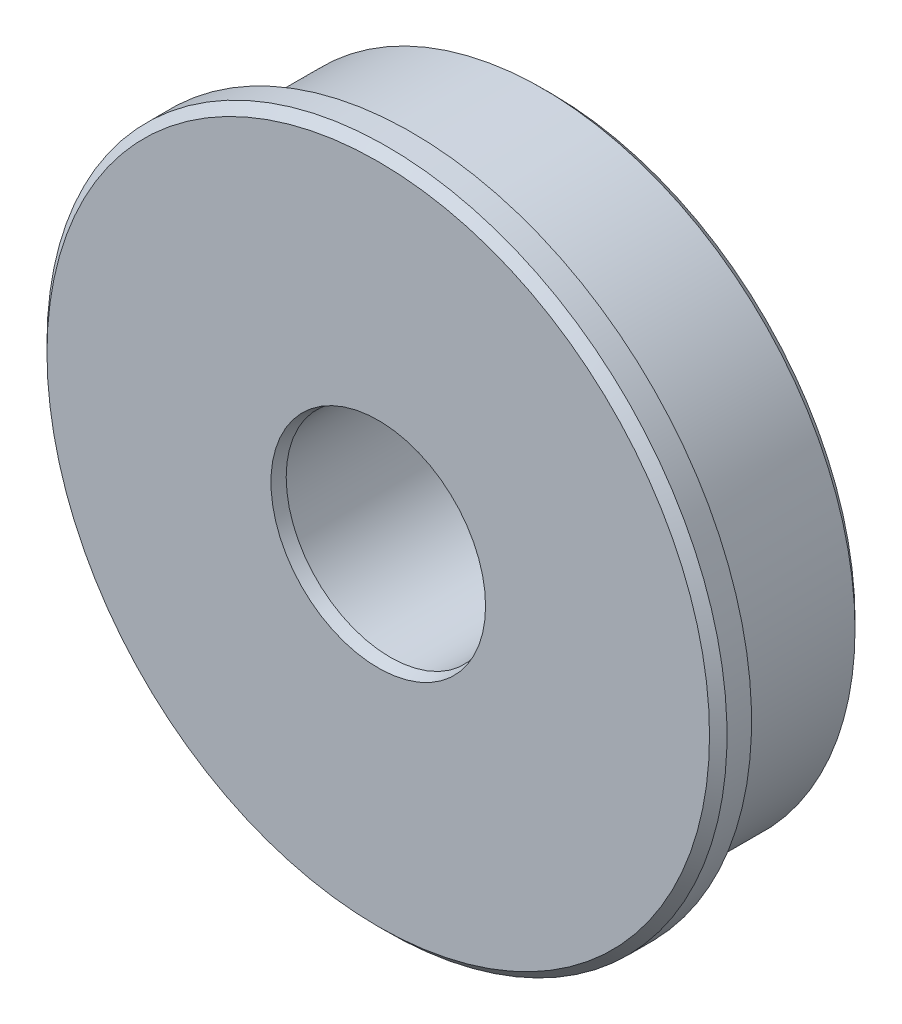
ISO-10303-21;
HEADER;
FILE_DESCRIPTION(('STEP AP214'),'2;1');
FILE_NAME('part.step','',(''),(''),'','','');
FILE_SCHEMA(('AUTOMOTIVE_DESIGN { 1 0 10303 214 1 1 1 1 }'));
ENDSEC;
DATA;
#1=APPLICATION_CONTEXT('core data for automotive mechanical design processes');
#2=APPLICATION_PROTOCOL_DEFINITION('international standard','automotive_design',2000,#1);
#3=PRODUCT_CONTEXT('',#1,'mechanical');
#4=PRODUCT('Part','Part','',(#3));
#5=PRODUCT_RELATED_PRODUCT_CATEGORY('part','',(#4));
#6=PRODUCT_DEFINITION_FORMATION('','',#4);
#7=PRODUCT_DEFINITION_CONTEXT('part definition',#1,'design');
#8=PRODUCT_DEFINITION('design','',#6,#7);
#9=PRODUCT_DEFINITION_SHAPE('','',#8);
#10=(LENGTH_UNIT() NAMED_UNIT(*) SI_UNIT(.MILLI.,.METRE.));
#11=(NAMED_UNIT(*) PLANE_ANGLE_UNIT() SI_UNIT($,.RADIAN.));
#12=(NAMED_UNIT(*) SI_UNIT($,.STERADIAN.) SOLID_ANGLE_UNIT());
#13=UNCERTAINTY_MEASURE_WITH_UNIT(LENGTH_MEASURE(1.E-05),#10,'distance_accuracy_value','');
#14=(GEOMETRIC_REPRESENTATION_CONTEXT(3) GLOBAL_UNCERTAINTY_ASSIGNED_CONTEXT((#13)) GLOBAL_UNIT_ASSIGNED_CONTEXT((#10,
#11,#12)) REPRESENTATION_CONTEXT('',''));
#15=CARTESIAN_POINT('',(0.,0.,0.));
#16=DIRECTION('',(0.,0.,1.));
#17=DIRECTION('',(1.,0.,0.));
#18=AXIS2_PLACEMENT_3D('',#15,#16,#17);
#19=CARTESIAN_POINT('',(0.,0.,7.92733999999998));
#20=DIRECTION('',(0.,0.,-1.));
#21=DIRECTION('',(-1.,0.,0.));
#22=AXIS2_PLACEMENT_3D('',#19,#20,#21);
#23=CYLINDRICAL_SURFACE('',#22,14.2875);
#24=CARTESIAN_POINT('',(0.,0.,5.89534));
#25=DIRECTION('',(0.,0.,-1.));
#26=DIRECTION('',(-1.,0.,0.));
#27=AXIS2_PLACEMENT_3D('',#24,#25,#26);
#28=CIRCLE('',#27,14.2875);
#29=CARTESIAN_POINT('',(-14.2875,0.,5.89534));
#30=VERTEX_POINT('',#29);
#31=EDGE_CURVE('E18',#30,#30,#28,.F.);
#32=ORIENTED_EDGE('',*,*,#31,.F.);
#33=EDGE_LOOP('',(#32));
#34=FACE_BOUND('',#33,.T.);
#35=CARTESIAN_POINT('',(0.,0.,0.399999999999989));
#36=DIRECTION('',(0.,0.,1.));
#37=DIRECTION('',(1.,0.,0.));
#38=AXIS2_PLACEMENT_3D('',#35,#36,#37);
#39=CIRCLE('',#38,14.2875);
#40=CARTESIAN_POINT('',(14.2875,0.,0.399999999999988));
#41=VERTEX_POINT('',#40);
#42=EDGE_CURVE('E30',#41,#41,#39,.F.);
#43=ORIENTED_EDGE('',*,*,#42,.F.);
#44=EDGE_LOOP('',(#43));
#45=FACE_BOUND('',#44,.T.);
#46=ADVANCED_FACE('F15',(#34,#45),#23,.T.);
#47=CARTESIAN_POINT('',(0.,0.,0.399999999999989));
#48=DIRECTION('',(0.,0.,1.));
#49=DIRECTION('',(0.,-1.,0.));
#50=AXIS2_PLACEMENT_3D('',#47,#48,#49);
#51=CONICAL_SURFACE('',#50,14.2875,0.785398163397453);
#52=ORIENTED_EDGE('',*,*,#42,.T.);
#53=EDGE_LOOP('',(#52));
#54=FACE_BOUND('',#53,.T.);
#55=CARTESIAN_POINT('',(0.,0.,0.));
#56=DIRECTION('',(0.,0.,1.));
#57=DIRECTION('',(0.,-1.,0.));
#58=AXIS2_PLACEMENT_3D('',#55,#56,#57);
#59=CIRCLE('',#58,13.8875);
#60=CARTESIAN_POINT('',(0.,-13.8875,0.));
#61=VERTEX_POINT('',#60);
#62=EDGE_CURVE('E46',#61,#61,#59,.F.);
#63=ORIENTED_EDGE('',*,*,#62,.F.);
#64=EDGE_LOOP('',(#63));
#65=FACE_BOUND('',#64,.T.);
#66=ADVANCED_FACE('F56',(#54,#65),#51,.T.);
#67=CARTESIAN_POINT('',(14.2875,0.,5.89534));
#68=DIRECTION('',(0.,0.,1.));
#69=DIRECTION('',(1.,0.,0.));
#70=AXIS2_PLACEMENT_3D('',#67,#68,#69);
#71=PLANE('',#70);
#72=ORIENTED_EDGE('',*,*,#31,.T.);
#73=EDGE_LOOP('',(#72));
#74=FACE_BOUND('',#73,.T.);
#75=CARTESIAN_POINT('',(0.,0.,5.89534));
#76=DIRECTION('',(0.,0.,-1.));
#77=DIRECTION('',(-1.,0.,0.));
#78=AXIS2_PLACEMENT_3D('',#75,#76,#77);
#79=CIRCLE('',#78,13.97);
#80=CARTESIAN_POINT('',(-13.97,0.,5.89534));
#81=VERTEX_POINT('',#80);
#82=EDGE_CURVE('E44',#81,#81,#79,.F.);
#83=ORIENTED_EDGE('',*,*,#82,.F.);
#84=EDGE_LOOP('',(#83));
#85=FACE_BOUND('',#84,.T.);
#86=ADVANCED_FACE('F65',(#74,#85),#71,.T.);
#87=CARTESIAN_POINT('',(0.,0.,0.));
#88=DIRECTION('',(0.,0.,-1.));
#89=DIRECTION('',(-1.,0.,0.));
#90=AXIS2_PLACEMENT_3D('',#87,#88,#89);
#91=PLANE('',#90);
#92=CARTESIAN_POINT('',(0.,0.,5.6843418860808E-11));
#93=DIRECTION('',(0.,0.,-1.));
#94=DIRECTION('',(-1.,0.,0.));
#95=AXIS2_PLACEMENT_3D('',#92,#93,#94);
#96=CIRCLE('',#95,4.91249999994738);
#97=CARTESIAN_POINT('',(-4.91249999994738,0.,5.6843418860808E-11));
#98=VERTEX_POINT('',#97);
#99=EDGE_CURVE('E41',#98,#98,#96,.F.);
#100=ORIENTED_EDGE('',*,*,#99,.T.);
#101=EDGE_LOOP('',(#100));
#102=FACE_BOUND('',#101,.T.);
#103=ORIENTED_EDGE('',*,*,#62,.T.);
#104=EDGE_LOOP('',(#103));
#105=FACE_BOUND('',#104,.T.);
#106=ADVANCED_FACE('F100',(#102,#105),#91,.T.);
#107=CARTESIAN_POINT('',(0.,0.,7.92733999999998));
#108=DIRECTION('',(0.,0.,-1.));
#109=DIRECTION('',(-1.,0.,0.));
#110=AXIS2_PLACEMENT_3D('',#107,#108,#109);
#111=CYLINDRICAL_SURFACE('',#110,13.97);
#112=CARTESIAN_POINT('',(0.,0.,6.40334000000001));
#113=DIRECTION('',(0.,0.,-1.));
#114=DIRECTION('',(-1.,0.,0.));
#115=AXIS2_PLACEMENT_3D('',#112,#113,#114);
#116=CIRCLE('',#115,13.97);
#117=CARTESIAN_POINT('',(-13.97,0.,6.40334000000001));
#118=VERTEX_POINT('',#117);
#119=EDGE_CURVE('E38',#118,#118,#116,.F.);
#120=ORIENTED_EDGE('',*,*,#119,.F.);
#121=EDGE_LOOP('',(#120));
#122=FACE_BOUND('',#121,.T.);
#123=ORIENTED_EDGE('',*,*,#82,.T.);
#124=EDGE_LOOP('',(#123));
#125=FACE_BOUND('',#124,.T.);
#126=ADVANCED_FACE('F96',(#122,#125),#111,.T.);
#127=CARTESIAN_POINT('',(0.,0.,1.13686837721616E-10));
#128=DIRECTION('',(0.,0.,-1.));
#129=DIRECTION('',(-1.,0.,0.));
#130=AXIS2_PLACEMENT_3D('',#127,#128,#129);
#131=CONICAL_SURFACE('',#130,4.91249999993215,0.261799387786168);
#132=CARTESIAN_POINT('',(0.,0.,0.559807621135305));
#133=DIRECTION('',(0.,0.,-1.));
#134=DIRECTION('',(-1.,0.,0.));
#135=AXIS2_PLACEMENT_3D('',#132,#133,#134);
#136=CIRCLE('',#135,4.76250000000001);
#137=CARTESIAN_POINT('',(-4.76250000000001,0.,0.559807621135305));
#138=VERTEX_POINT('',#137);
#139=EDGE_CURVE('E37',#138,#138,#136,.F.);
#140=ORIENTED_EDGE('',*,*,#139,.T.);
#141=EDGE_LOOP('',(#140));
#142=FACE_BOUND('',#141,.T.);
#143=ORIENTED_EDGE('',*,*,#99,.F.);
#144=EDGE_LOOP('',(#143));
#145=FACE_BOUND('',#144,.T.);
#146=ADVANCED_FACE('F92',(#142,#145),#131,.F.);
#147=CARTESIAN_POINT('',(13.9700000000001,0.,6.40333999999998));
#148=DIRECTION('',(0.,0.,-1.));
#149=DIRECTION('',(-1.,0.,0.));
#150=AXIS2_PLACEMENT_3D('',#147,#148,#149);
#151=PLANE('',#150);
#152=ORIENTED_EDGE('',*,*,#119,.T.);
#153=EDGE_LOOP('',(#152));
#154=FACE_BOUND('',#153,.T.);
#155=CARTESIAN_POINT('',(0.,0.,6.40334000000001));
#156=DIRECTION('',(0.,0.,-1.));
#157=DIRECTION('',(-1.,0.,0.));
#158=AXIS2_PLACEMENT_3D('',#155,#156,#157);
#159=CIRCLE('',#158,15.5575);
#160=CARTESIAN_POINT('',(-15.5575,0.,6.40334000000001));
#161=VERTEX_POINT('',#160);
#162=EDGE_CURVE('E33',#161,#161,#159,.F.);
#163=ORIENTED_EDGE('',*,*,#162,.F.);
#164=EDGE_LOOP('',(#163));
#165=FACE_BOUND('',#164,.T.);
#166=ADVANCED_FACE('F88',(#154,#165),#151,.T.);
#167=CARTESIAN_POINT('',(0.,0.,7.92733999999998));
#168=DIRECTION('',(0.,0.,-1.));
#169=DIRECTION('',(-1.,0.,0.));
#170=AXIS2_PLACEMENT_3D('',#167,#168,#169);
#171=CYLINDRICAL_SURFACE('',#170,4.76250000000001);
#172=CARTESIAN_POINT('',(0.,0.,7.37734000006185));
#173=DIRECTION('',(0.,0.,1.));
#174=DIRECTION('',(1.,0.,0.));
#175=AXIS2_PLACEMENT_3D('',#172,#173,#174);
#176=CIRCLE('',#175,4.76250000002665);
#177=CARTESIAN_POINT('',(4.76250000002665,0.,7.37734000006185));
#178=VERTEX_POINT('',#177);
#179=EDGE_CURVE('E36',#178,#178,#176,.T.);
#180=ORIENTED_EDGE('',*,*,#179,.T.);
#181=EDGE_LOOP('',(#180));
#182=FACE_BOUND('',#181,.T.);
#183=ORIENTED_EDGE('',*,*,#139,.F.);
#184=EDGE_LOOP('',(#183));
#185=FACE_BOUND('',#184,.T.);
#186=ADVANCED_FACE('F84',(#182,#185),#171,.F.);
#187=CARTESIAN_POINT('',(0.,0.,7.92733999999998));
#188=DIRECTION('',(0.,0.,-1.));
#189=DIRECTION('',(-1.,0.,0.));
#190=AXIS2_PLACEMENT_3D('',#187,#188,#189);
#191=CYLINDRICAL_SURFACE('',#190,15.5575);
#192=ORIENTED_EDGE('',*,*,#162,.T.);
#193=EDGE_LOOP('',(#192));
#194=FACE_BOUND('',#193,.T.);
#195=CARTESIAN_POINT('',(0.,0.,7.52734));
#196=DIRECTION('',(0.,0.,-1.));
#197=DIRECTION('',(-1.,0.,0.));
#198=AXIS2_PLACEMENT_3D('',#195,#196,#197);
#199=CIRCLE('',#198,15.5575);
#200=CARTESIAN_POINT('',(-15.5575,0.,7.52734));
#201=VERTEX_POINT('',#200);
#202=EDGE_CURVE('E27',#201,#201,#199,.F.);
#203=ORIENTED_EDGE('',*,*,#202,.F.);
#204=EDGE_LOOP('',(#203));
#205=FACE_BOUND('',#204,.T.);
#206=ADVANCED_FACE('F80',(#194,#205),#191,.T.);
#207=CARTESIAN_POINT('',(0.,0.,7.92733999975326));
#208=DIRECTION('',(0.,0.,1.));
#209=DIRECTION('',(1.,0.,0.));
#210=AXIS2_PLACEMENT_3D('',#207,#208,#209);
#211=CONICAL_SURFACE('',#210,4.90987205577653,0.261799387787974);
#212=ORIENTED_EDGE('',*,*,#179,.F.);
#213=EDGE_LOOP('',(#212));
#214=FACE_BOUND('',#213,.T.);
#215=CARTESIAN_POINT('',(0.,0.,7.92733999998063));
#216=DIRECTION('',(0.,0.,1.));
#217=DIRECTION('',(1.,0.,0.));
#218=AXIS2_PLACEMENT_3D('',#215,#216,#217);
#219=CIRCLE('',#218,4.90987205583746);
#220=CARTESIAN_POINT('',(4.90987205583746,0.,7.92733999998063));
#221=VERTEX_POINT('',#220);
#222=EDGE_CURVE('E22',#221,#221,#219,.F.);
#223=ORIENTED_EDGE('',*,*,#222,.F.);
#224=EDGE_LOOP('',(#223));
#225=FACE_BOUND('',#224,.T.);
#226=ADVANCED_FACE('F73',(#214,#225),#211,.F.);
#227=CARTESIAN_POINT('',(0.,0.,7.52734));
#228=DIRECTION('',(0.,0.,-1.));
#229=DIRECTION('',(-1.,0.,0.));
#230=AXIS2_PLACEMENT_3D('',#227,#228,#229);
#231=CONICAL_SURFACE('',#230,15.5575,0.785398163397449);
#232=ORIENTED_EDGE('',*,*,#202,.T.);
#233=EDGE_LOOP('',(#232));
#234=FACE_BOUND('',#233,.T.);
#235=CARTESIAN_POINT('',(0.,0.,7.92734));
#236=DIRECTION('',(0.,0.,-1.));
#237=DIRECTION('',(-1.,0.,0.));
#238=AXIS2_PLACEMENT_3D('',#235,#236,#237);
#239=CIRCLE('',#238,15.1575);
#240=CARTESIAN_POINT('',(-15.1575,0.,7.92734));
#241=VERTEX_POINT('',#240);
#242=EDGE_CURVE('E10',#241,#241,#239,.F.);
#243=ORIENTED_EDGE('',*,*,#242,.F.);
#244=EDGE_LOOP('',(#243));
#245=FACE_BOUND('',#244,.T.);
#246=ADVANCED_FACE('F68',(#234,#245),#231,.T.);
#247=CARTESIAN_POINT('',(15.5575000000001,0.,7.92733999999998));
#248=DIRECTION('',(0.,0.,1.));
#249=DIRECTION('',(1.,0.,0.));
#250=AXIS2_PLACEMENT_3D('',#247,#248,#249);
#251=PLANE('',#250);
#252=ORIENTED_EDGE('',*,*,#242,.T.);
#253=EDGE_LOOP('',(#252));
#254=FACE_BOUND('',#253,.T.);
#255=ORIENTED_EDGE('',*,*,#222,.T.);
#256=EDGE_LOOP('',(#255));
#257=FACE_BOUND('',#256,.T.);
#258=ADVANCED_FACE('F66',(#254,#257),#251,.T.);
#259=CLOSED_SHELL('',(#46,#66,#86,#106,#126,#146,#166,#186,#206,#226,#246,#258));
#260=MANIFOLD_SOLID_BREP('B1',#259);
#261=ADVANCED_BREP_SHAPE_REPRESENTATION('',(#18,#260),#14);
#262=SHAPE_DEFINITION_REPRESENTATION(#9,#261);
ENDSEC;
END-ISO-10303-21;
